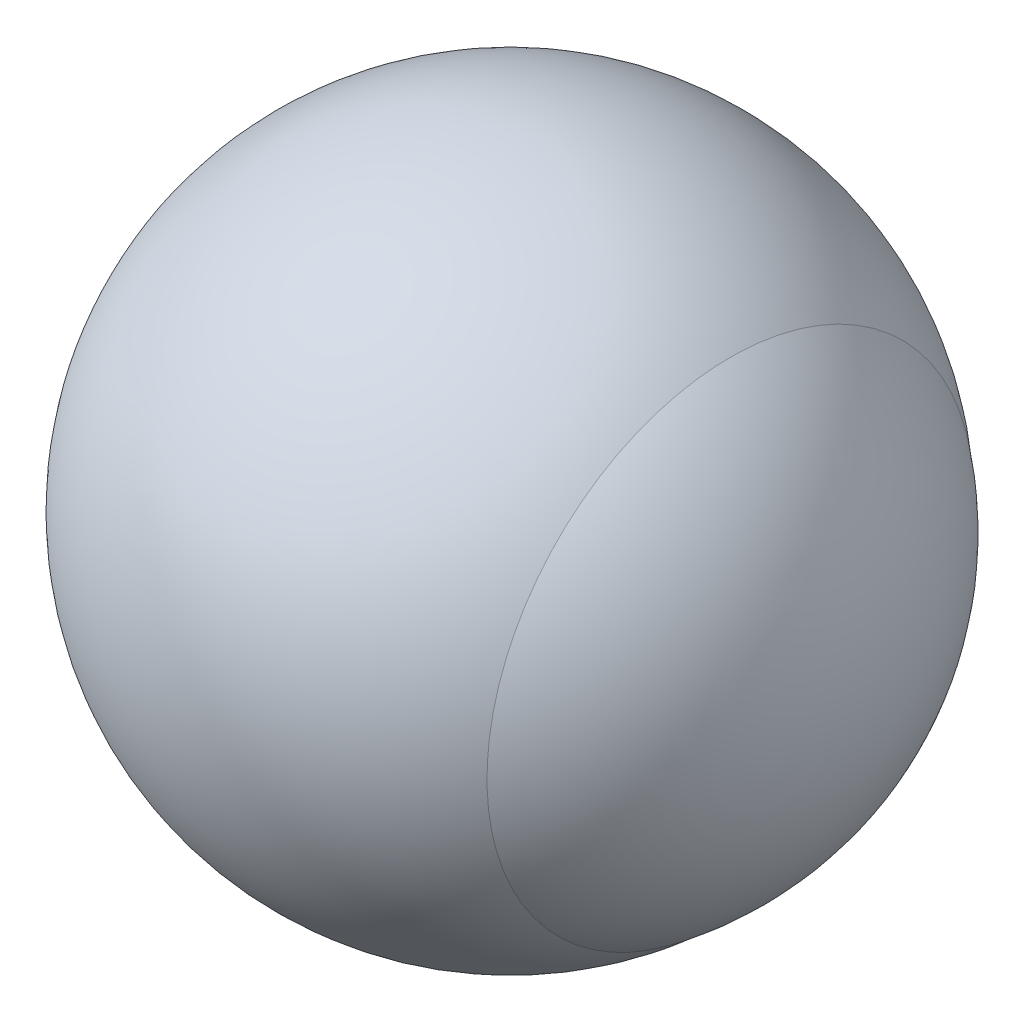
ISO-10303-21;
HEADER;
FILE_DESCRIPTION(('STEP AP214'),'2;1');
FILE_NAME('part.step','',(''),(''),'','','');
FILE_SCHEMA(('AUTOMOTIVE_DESIGN { 1 0 10303 214 1 1 1 1 }'));
ENDSEC;
DATA;
#1=APPLICATION_CONTEXT('core data for automotive mechanical design processes');
#2=APPLICATION_PROTOCOL_DEFINITION('international standard','automotive_design',2000,#1);
#3=PRODUCT_CONTEXT('',#1,'mechanical');
#4=PRODUCT('Part','Part','',(#3));
#5=PRODUCT_RELATED_PRODUCT_CATEGORY('part','',(#4));
#6=PRODUCT_DEFINITION_FORMATION('','',#4);
#7=PRODUCT_DEFINITION_CONTEXT('part definition',#1,'design');
#8=PRODUCT_DEFINITION('design','',#6,#7);
#9=PRODUCT_DEFINITION_SHAPE('','',#8);
#10=(LENGTH_UNIT() NAMED_UNIT(*) SI_UNIT(.MILLI.,.METRE.));
#11=(NAMED_UNIT(*) PLANE_ANGLE_UNIT() SI_UNIT($,.RADIAN.));
#12=(NAMED_UNIT(*) SI_UNIT($,.STERADIAN.) SOLID_ANGLE_UNIT());
#13=UNCERTAINTY_MEASURE_WITH_UNIT(LENGTH_MEASURE(1.E-05),#10,'distance_accuracy_value','');
#14=(GEOMETRIC_REPRESENTATION_CONTEXT(3) GLOBAL_UNCERTAINTY_ASSIGNED_CONTEXT((#13)) GLOBAL_UNIT_ASSIGNED_CONTEXT((#10,
#11,#12)) REPRESENTATION_CONTEXT('',''));
#15=CARTESIAN_POINT('',(0.,0.,0.));
#16=DIRECTION('',(0.,0.,1.));
#17=DIRECTION('',(1.,0.,0.));
#18=AXIS2_PLACEMENT_3D('',#15,#16,#17);
#19=CARTESIAN_POINT('',(-10.6823313273079,26.8700576850888,-13.4350288425444));
#20=DIRECTION('',(1.,0.,0.));
#21=DIRECTION('',(0.,-1.,0.));
#22=AXIS2_PLACEMENT_3D('',#19,#20,#21);
#23=SPHERICAL_SURFACE('',#22,22.2473024847636);
#24=CARTESIAN_POINT('',(2.66461074212065,26.8700576850888,-13.4350288425444));
#25=DIRECTION('',(1.,0.,0.));
#26=DIRECTION('',(0.,0.,-1.));
#27=AXIS2_PLACEMENT_3D('',#24,#25,#26);
#28=CIRCLE('',#27,17.7989214629395);
#29=CARTESIAN_POINT('',(2.66461074212065,26.8700576850888,-31.2339503054839));
#30=VERTEX_POINT('',#29);
#31=EDGE_CURVE('E10',#30,#30,#28,.T.);
#32=ORIENTED_EDGE('',*,*,#31,.T.);
#33=EDGE_LOOP('',(#32));
#34=FACE_BOUND('',#33,.T.);
#35=ADVANCED_FACE('F31',(#34),#23,.T.);
#36=CARTESIAN_POINT('',(-13.4350288425444,26.8700576850888,-13.4350288425444));
#37=DIRECTION('',(0.,0.,1.));
#38=DIRECTION('',(0.,1.,0.));
#39=AXIS2_PLACEMENT_3D('',#36,#37,#38);
#40=SPHERICAL_SURFACE('',#39,24.);
#41=CARTESIAN_POINT('',(-13.4350288425444,26.8700576850888,-13.4350288425444));
#42=DIRECTION('',(1.,0.,0.));
#43=DIRECTION('',(0.,0.,-1.));
#44=AXIS2_PLACEMENT_3D('',#41,#42,#43);
#45=SPHERICAL_SURFACE('',#44,24.);
#46=ORIENTED_EDGE('',*,*,#31,.F.);
#47=EDGE_LOOP('',(#46));
#48=FACE_BOUND('',#47,.T.);
#49=ADVANCED_FACE('F33',(#48),#45,.T.);
#50=CLOSED_SHELL('',(#35,#49));
#51=MANIFOLD_SOLID_BREP('B2',#50);
#52=ADVANCED_BREP_SHAPE_REPRESENTATION('',(#18,#51),#14);
#53=SHAPE_DEFINITION_REPRESENTATION(#9,#52);
ENDSEC;
END-ISO-10303-21;
